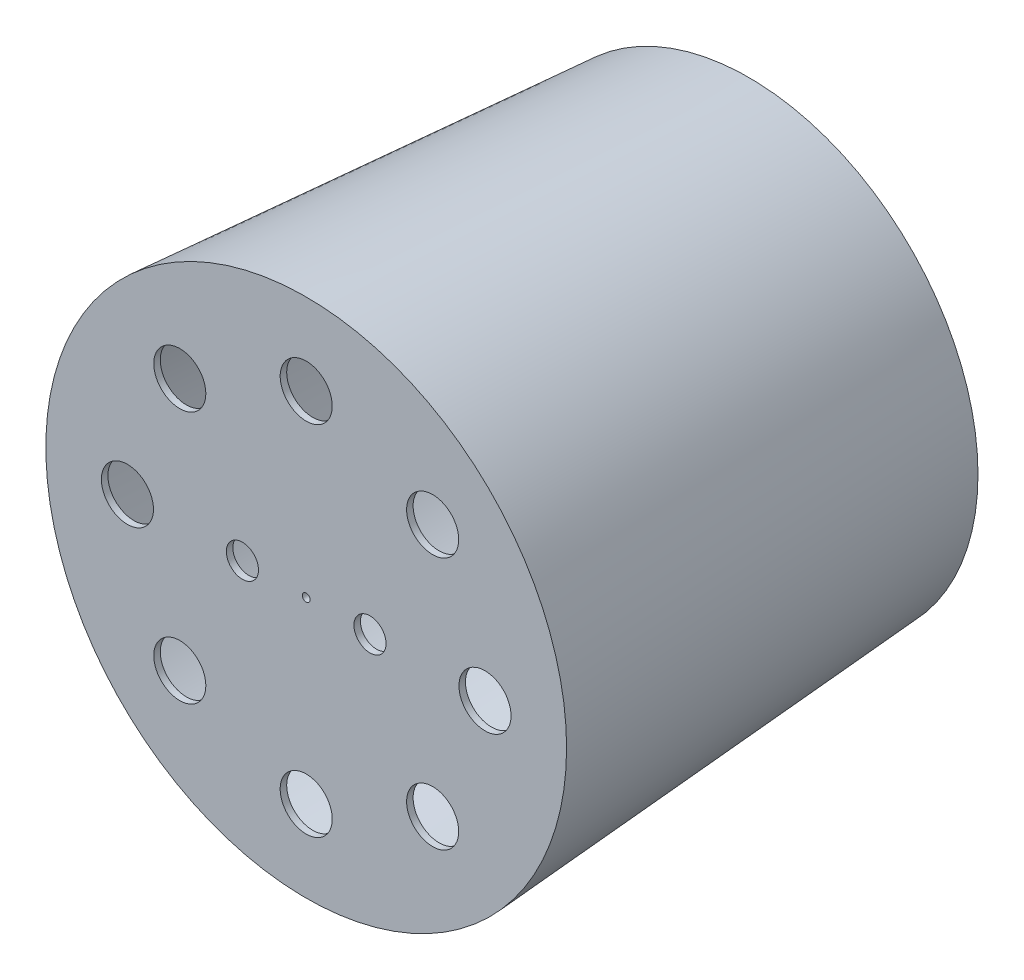
ISO-10303-21;
HEADER;
FILE_DESCRIPTION(('STEP AP214'),'2;1');
FILE_NAME('part.step','',(''),(''),'','','');
FILE_SCHEMA(('AUTOMOTIVE_DESIGN { 1 0 10303 214 1 1 1 1 }'));
ENDSEC;
DATA;
#1=APPLICATION_CONTEXT('core data for automotive mechanical design processes');
#2=APPLICATION_PROTOCOL_DEFINITION('international standard','automotive_design',2000,#1);
#3=PRODUCT_CONTEXT('',#1,'mechanical');
#4=PRODUCT('Part','Part','',(#3));
#5=PRODUCT_RELATED_PRODUCT_CATEGORY('part','',(#4));
#6=PRODUCT_DEFINITION_FORMATION('','',#4);
#7=PRODUCT_DEFINITION_CONTEXT('part definition',#1,'design');
#8=PRODUCT_DEFINITION('design','',#6,#7);
#9=PRODUCT_DEFINITION_SHAPE('','',#8);
#10=(LENGTH_UNIT() NAMED_UNIT(*) SI_UNIT(.MILLI.,.METRE.));
#11=(NAMED_UNIT(*) PLANE_ANGLE_UNIT() SI_UNIT($,.RADIAN.));
#12=(NAMED_UNIT(*) SI_UNIT($,.STERADIAN.) SOLID_ANGLE_UNIT());
#13=UNCERTAINTY_MEASURE_WITH_UNIT(LENGTH_MEASURE(1.E-05),#10,'distance_accuracy_value','');
#14=(GEOMETRIC_REPRESENTATION_CONTEXT(3) GLOBAL_UNCERTAINTY_ASSIGNED_CONTEXT((#13)) GLOBAL_UNIT_ASSIGNED_CONTEXT((#10,
#11,#12)) REPRESENTATION_CONTEXT('',''));
#15=CARTESIAN_POINT('',(0.,0.,0.));
#16=DIRECTION('',(0.,0.,1.));
#17=DIRECTION('',(1.,0.,0.));
#18=AXIS2_PLACEMENT_3D('',#15,#16,#17);
#19=CARTESIAN_POINT('',(0.,0.,-85.));
#20=DIRECTION('',(0.,0.,1.));
#21=DIRECTION('',(1.,0.,0.));
#22=AXIS2_PLACEMENT_3D('',#19,#20,#21);
#23=PLANE('',#22);
#24=CARTESIAN_POINT('',(0.,0.,-85.));
#25=DIRECTION('',(0.,0.,1.));
#26=DIRECTION('',(1.,0.,0.));
#27=AXIS2_PLACEMENT_3D('',#24,#25,#26);
#28=CIRCLE('',#27,85.4937793655562);
#29=CARTESIAN_POINT('',(85.4937793655561,0.,-85.));
#30=VERTEX_POINT('',#29);
#31=EDGE_CURVE('E97',#30,#30,#28,.T.);
#32=ORIENTED_EDGE('',*,*,#31,.T.);
#33=EDGE_LOOP('',(#32));
#34=FACE_BOUND('',#33,.T.);
#35=CARTESIAN_POINT('',(0.,0.,-85.));
#36=DIRECTION('',(0.,0.,1.));
#37=DIRECTION('',(1.,0.,0.));
#38=AXIS2_PLACEMENT_3D('',#35,#36,#37);
#39=CIRCLE('',#38,88.);
#40=CARTESIAN_POINT('',(88.,0.,-85.));
#41=VERTEX_POINT('',#40);
#42=EDGE_CURVE('E38',#41,#41,#39,.T.);
#43=ORIENTED_EDGE('',*,*,#42,.F.);
#44=EDGE_LOOP('',(#43));
#45=FACE_BOUND('',#44,.T.);
#46=ADVANCED_FACE('F31',(#34,#45),#23,.F.);
#47=CARTESIAN_POINT('',(-100.,0.,85.));
#48=DIRECTION('',(0.,0.,-1.));
#49=DIRECTION('',(-1.,0.,0.));
#50=AXIS2_PLACEMENT_3D('',#47,#48,#49);
#51=PLANE('',#50);
#52=CARTESIAN_POINT('',(48.5547126704819,48.5547126704831,85.));
#53=DIRECTION('',(0.,0.,1.));
#54=DIRECTION('',(1.,0.,0.));
#55=AXIS2_PLACEMENT_3D('',#52,#53,#54);
#56=CIRCLE('',#55,10.);
#57=CARTESIAN_POINT('',(58.5547126704819,48.5547126704831,85.));
#58=VERTEX_POINT('',#57);
#59=EDGE_CURVE('E56',#58,#58,#56,.T.);
#60=ORIENTED_EDGE('',*,*,#59,.F.);
#61=EDGE_LOOP('',(#60));
#62=FACE_BOUND('',#61,.T.);
#63=CARTESIAN_POINT('',(68.666733175726,2.91902965728407E-12,85.));
#64=DIRECTION('',(0.,0.,1.));
#65=DIRECTION('',(1.,0.,0.));
#66=AXIS2_PLACEMENT_3D('',#63,#64,#65);
#67=CIRCLE('',#66,9.99999999999999);
#68=CARTESIAN_POINT('',(78.666733175726,2.91902965728407E-12,85.));
#69=VERTEX_POINT('',#68);
#70=EDGE_CURVE('E139',#69,#69,#67,.T.);
#71=ORIENTED_EDGE('',*,*,#70,.F.);
#72=EDGE_LOOP('',(#71));
#73=FACE_BOUND('',#72,.T.);
#74=CARTESIAN_POINT('',(48.554712670486,-48.554712670479,85.));
#75=DIRECTION('',(0.,0.,1.));
#76=DIRECTION('',(1.,0.,0.));
#77=AXIS2_PLACEMENT_3D('',#74,#75,#76);
#78=CIRCLE('',#77,10.);
#79=CARTESIAN_POINT('',(58.554712670486,-48.554712670479,85.));
#80=VERTEX_POINT('',#79);
#81=EDGE_CURVE('E143',#80,#80,#78,.T.);
#82=ORIENTED_EDGE('',*,*,#81,.F.);
#83=EDGE_LOOP('',(#82));
#84=FACE_BOUND('',#83,.T.);
#85=CARTESIAN_POINT('',(5.83420882102425E-12,-68.6667331757231,85.));
#86=DIRECTION('',(0.,0.,1.));
#87=DIRECTION('',(1.,0.,0.));
#88=AXIS2_PLACEMENT_3D('',#85,#86,#87);
#89=CIRCLE('',#88,10.);
#90=CARTESIAN_POINT('',(10.0000000000058,-68.6667331757231,85.));
#91=VERTEX_POINT('',#90);
#92=EDGE_CURVE('E147',#91,#91,#89,.T.);
#93=ORIENTED_EDGE('',*,*,#92,.F.);
#94=EDGE_LOOP('',(#93));
#95=FACE_BOUND('',#94,.T.);
#96=CARTESIAN_POINT('',(-48.5547126704761,-48.5547126704831,85.));
#97=DIRECTION('',(0.,0.,1.));
#98=DIRECTION('',(1.,0.,0.));
#99=AXIS2_PLACEMENT_3D('',#96,#97,#98);
#100=CIRCLE('',#99,10.);
#101=CARTESIAN_POINT('',(-38.5547126704761,-48.5547126704831,85.));
#102=VERTEX_POINT('',#101);
#103=EDGE_CURVE('E151',#102,#102,#100,.T.);
#104=ORIENTED_EDGE('',*,*,#103,.F.);
#105=EDGE_LOOP('',(#104));
#106=FACE_BOUND('',#105,.T.);
#107=CARTESIAN_POINT('',(-68.6667331757202,-2.92743890678323E-12,85.));
#108=DIRECTION('',(0.,0.,1.));
#109=DIRECTION('',(1.,0.,0.));
#110=AXIS2_PLACEMENT_3D('',#107,#108,#109);
#111=CIRCLE('',#110,10.);
#112=CARTESIAN_POINT('',(-58.6667331757202,-2.92743890678323E-12,85.));
#113=VERTEX_POINT('',#112);
#114=EDGE_CURVE('E155',#113,#113,#111,.T.);
#115=ORIENTED_EDGE('',*,*,#114,.F.);
#116=EDGE_LOOP('',(#115));
#117=FACE_BOUND('',#116,.T.);
#118=CARTESIAN_POINT('',(-48.5547126704802,48.554712670479,85.));
#119=DIRECTION('',(0.,0.,1.));
#120=DIRECTION('',(1.,0.,0.));
#121=AXIS2_PLACEMENT_3D('',#118,#119,#120);
#122=CIRCLE('',#121,10.);
#123=CARTESIAN_POINT('',(-38.5547126704802,48.554712670479,85.));
#124=VERTEX_POINT('',#123);
#125=EDGE_CURVE('E80',#124,#124,#122,.T.);
#126=ORIENTED_EDGE('',*,*,#125,.F.);
#127=EDGE_LOOP('',(#126));
#128=FACE_BOUND('',#127,.T.);
#129=CARTESIAN_POINT('',(0.,68.6667331757231,85.));
#130=DIRECTION('',(0.,0.,1.));
#131=DIRECTION('',(1.,0.,0.));
#132=AXIS2_PLACEMENT_3D('',#129,#130,#131);
#133=CIRCLE('',#132,10.);
#134=CARTESIAN_POINT('',(10.,68.6667331757231,85.));
#135=VERTEX_POINT('',#134);
#136=EDGE_CURVE('E51',#135,#135,#133,.T.);
#137=ORIENTED_EDGE('',*,*,#136,.F.);
#138=EDGE_LOOP('',(#137));
#139=FACE_BOUND('',#138,.T.);
#140=CARTESIAN_POINT('',(-24.5,0.,85.));
#141=DIRECTION('',(0.,0.,1.));
#142=DIRECTION('',(1.,0.,0.));
#143=AXIS2_PLACEMENT_3D('',#140,#141,#142);
#144=CIRCLE('',#143,6.175);
#145=CARTESIAN_POINT('',(-18.325,0.,85.));
#146=VERTEX_POINT('',#145);
#147=EDGE_CURVE('E82',#146,#146,#144,.T.);
#148=ORIENTED_EDGE('',*,*,#147,.F.);
#149=EDGE_LOOP('',(#148));
#150=FACE_BOUND('',#149,.T.);
#151=CARTESIAN_POINT('',(24.5,0.,85.));
#152=DIRECTION('',(0.,0.,1.));
#153=DIRECTION('',(1.,0.,0.));
#154=AXIS2_PLACEMENT_3D('',#151,#152,#153);
#155=CIRCLE('',#154,6.175);
#156=CARTESIAN_POINT('',(30.675,0.,85.));
#157=VERTEX_POINT('',#156);
#158=EDGE_CURVE('E89',#157,#157,#155,.T.);
#159=ORIENTED_EDGE('',*,*,#158,.F.);
#160=EDGE_LOOP('',(#159));
#161=FACE_BOUND('',#160,.T.);
#162=CARTESIAN_POINT('',(0.,0.,85.));
#163=DIRECTION('',(0.,0.,1.));
#164=DIRECTION('',(1.,0.,0.));
#165=AXIS2_PLACEMENT_3D('',#162,#163,#164);
#166=CIRCLE('',#165,1.5);
#167=CARTESIAN_POINT('',(1.5,0.,85.));
#168=VERTEX_POINT('',#167);
#169=EDGE_CURVE('E94',#168,#168,#166,.T.);
#170=ORIENTED_EDGE('',*,*,#169,.F.);
#171=EDGE_LOOP('',(#170));
#172=FACE_BOUND('',#171,.T.);
#173=CARTESIAN_POINT('',(0.,0.,85.));
#174=DIRECTION('',(0.,0.,1.));
#175=DIRECTION('',(1.,0.,0.));
#176=AXIS2_PLACEMENT_3D('',#173,#174,#175);
#177=CIRCLE('',#176,100.);
#178=CARTESIAN_POINT('',(100.,0.,85.));
#179=VERTEX_POINT('',#178);
#180=EDGE_CURVE('E10',#179,#179,#177,.T.);
#181=ORIENTED_EDGE('',*,*,#180,.T.);
#182=EDGE_LOOP('',(#181));
#183=FACE_BOUND('',#182,.T.);
#184=ADVANCED_FACE('F124',(#62,#73,#84,#95,#106,#117,#128,#139,#150,#161,#172,#183),#51,.F.);
#185=CARTESIAN_POINT('',(0.,0.,-85.));
#186=DIRECTION('',(0.,0.,1.));
#187=DIRECTION('',(1.,0.,0.));
#188=AXIS2_PLACEMENT_3D('',#185,#186,#187);
#189=CONICAL_SURFACE('',#188,88.,0.0704713445787956);
#190=ORIENTED_EDGE('',*,*,#180,.F.);
#191=EDGE_LOOP('',(#190));
#192=FACE_BOUND('',#191,.T.);
#193=ORIENTED_EDGE('',*,*,#42,.T.);
#194=EDGE_LOOP('',(#193));
#195=FACE_BOUND('',#194,.T.);
#196=ADVANCED_FACE('F119',(#192,#195),#189,.T.);
#197=CARTESIAN_POINT('',(-100.,0.,82.5));
#198=DIRECTION('',(0.,0.,-1.));
#199=DIRECTION('',(-1.,0.,0.));
#200=AXIS2_PLACEMENT_3D('',#197,#198,#199);
#201=PLANE('',#200);
#202=CARTESIAN_POINT('',(48.5547126704819,48.5547126704831,82.5));
#203=DIRECTION('',(0.,0.,-1.));
#204=DIRECTION('',(-1.,0.,0.));
#205=AXIS2_PLACEMENT_3D('',#202,#203,#204);
#206=CIRCLE('',#205,10.);
#207=CARTESIAN_POINT('',(38.5547126704819,48.5547126704831,82.5));
#208=VERTEX_POINT('',#207);
#209=EDGE_CURVE('E34',#208,#208,#206,.T.);
#210=ORIENTED_EDGE('',*,*,#209,.F.);
#211=EDGE_LOOP('',(#210));
#212=FACE_BOUND('',#211,.T.);
#213=CARTESIAN_POINT('',(68.666733175726,2.91902965728407E-12,82.5));
#214=DIRECTION('',(0.,0.,-1.));
#215=DIRECTION('',(-1.,0.,0.));
#216=AXIS2_PLACEMENT_3D('',#213,#214,#215);
#217=CIRCLE('',#216,9.99999999999999);
#218=CARTESIAN_POINT('',(58.666733175726,2.91902965728407E-12,82.5));
#219=VERTEX_POINT('',#218);
#220=EDGE_CURVE('E67',#219,#219,#217,.T.);
#221=ORIENTED_EDGE('',*,*,#220,.F.);
#222=EDGE_LOOP('',(#221));
#223=FACE_BOUND('',#222,.T.);
#224=CARTESIAN_POINT('',(48.554712670486,-48.554712670479,82.5));
#225=DIRECTION('',(0.,0.,-1.));
#226=DIRECTION('',(-1.,0.,0.));
#227=AXIS2_PLACEMENT_3D('',#224,#225,#226);
#228=CIRCLE('',#227,10.);
#229=CARTESIAN_POINT('',(38.554712670486,-48.554712670479,82.5));
#230=VERTEX_POINT('',#229);
#231=EDGE_CURVE('E65',#230,#230,#228,.T.);
#232=ORIENTED_EDGE('',*,*,#231,.F.);
#233=EDGE_LOOP('',(#232));
#234=FACE_BOUND('',#233,.T.);
#235=CARTESIAN_POINT('',(5.83420882102425E-12,-68.6667331757231,82.5));
#236=DIRECTION('',(0.,0.,-1.));
#237=DIRECTION('',(-1.,0.,0.));
#238=AXIS2_PLACEMENT_3D('',#235,#236,#237);
#239=CIRCLE('',#238,10.);
#240=CARTESIAN_POINT('',(-9.99999999999417,-68.6667331757231,82.5));
#241=VERTEX_POINT('',#240);
#242=EDGE_CURVE('E62',#241,#241,#239,.T.);
#243=ORIENTED_EDGE('',*,*,#242,.F.);
#244=EDGE_LOOP('',(#243));
#245=FACE_BOUND('',#244,.T.);
#246=CARTESIAN_POINT('',(-48.5547126704761,-48.5547126704831,82.5));
#247=DIRECTION('',(0.,0.,-1.));
#248=DIRECTION('',(-1.,0.,0.));
#249=AXIS2_PLACEMENT_3D('',#246,#247,#248);
#250=CIRCLE('',#249,10.);
#251=CARTESIAN_POINT('',(-58.5547126704761,-48.5547126704831,82.5));
#252=VERTEX_POINT('',#251);
#253=EDGE_CURVE('E59',#252,#252,#250,.T.);
#254=ORIENTED_EDGE('',*,*,#253,.F.);
#255=EDGE_LOOP('',(#254));
#256=FACE_BOUND('',#255,.T.);
#257=CARTESIAN_POINT('',(-68.6667331757202,-2.92743890678323E-12,82.5));
#258=DIRECTION('',(0.,0.,-1.));
#259=DIRECTION('',(-1.,0.,0.));
#260=AXIS2_PLACEMENT_3D('',#257,#258,#259);
#261=CIRCLE('',#260,10.);
#262=CARTESIAN_POINT('',(-78.6667331757202,-2.92743890678323E-12,82.5));
#263=VERTEX_POINT('',#262);
#264=EDGE_CURVE('E55',#263,#263,#261,.T.);
#265=ORIENTED_EDGE('',*,*,#264,.F.);
#266=EDGE_LOOP('',(#265));
#267=FACE_BOUND('',#266,.T.);
#268=CARTESIAN_POINT('',(-48.5547126704802,48.554712670479,82.5));
#269=DIRECTION('',(0.,0.,-1.));
#270=DIRECTION('',(-1.,0.,0.));
#271=AXIS2_PLACEMENT_3D('',#268,#269,#270);
#272=CIRCLE('',#271,10.);
#273=CARTESIAN_POINT('',(-58.5547126704802,48.554712670479,82.5));
#274=VERTEX_POINT('',#273);
#275=EDGE_CURVE('E52',#274,#274,#272,.T.);
#276=ORIENTED_EDGE('',*,*,#275,.F.);
#277=EDGE_LOOP('',(#276));
#278=FACE_BOUND('',#277,.T.);
#279=CARTESIAN_POINT('',(0.,68.6667331757231,82.5));
#280=DIRECTION('',(0.,0.,-1.));
#281=DIRECTION('',(-1.,0.,0.));
#282=AXIS2_PLACEMENT_3D('',#279,#280,#281);
#283=CIRCLE('',#282,10.);
#284=CARTESIAN_POINT('',(-10.,68.6667331757231,82.5));
#285=VERTEX_POINT('',#284);
#286=EDGE_CURVE('E47',#285,#285,#283,.T.);
#287=ORIENTED_EDGE('',*,*,#286,.F.);
#288=EDGE_LOOP('',(#287));
#289=FACE_BOUND('',#288,.T.);
#290=CARTESIAN_POINT('',(-24.5,0.,82.5));
#291=DIRECTION('',(0.,0.,-1.));
#292=DIRECTION('',(-1.,0.,0.));
#293=AXIS2_PLACEMENT_3D('',#290,#291,#292);
#294=CIRCLE('',#293,6.175);
#295=CARTESIAN_POINT('',(-30.675,0.,82.5));
#296=VERTEX_POINT('',#295);
#297=EDGE_CURVE('E86',#296,#296,#294,.F.);
#298=ORIENTED_EDGE('',*,*,#297,.T.);
#299=EDGE_LOOP('',(#298));
#300=FACE_BOUND('',#299,.T.);
#301=CARTESIAN_POINT('',(24.5,0.,82.5));
#302=DIRECTION('',(0.,0.,-1.));
#303=DIRECTION('',(-1.,0.,0.));
#304=AXIS2_PLACEMENT_3D('',#301,#302,#303);
#305=CIRCLE('',#304,6.175);
#306=CARTESIAN_POINT('',(18.325,0.,82.5));
#307=VERTEX_POINT('',#306);
#308=EDGE_CURVE('E50',#307,#307,#305,.F.);
#309=ORIENTED_EDGE('',*,*,#308,.T.);
#310=EDGE_LOOP('',(#309));
#311=FACE_BOUND('',#310,.T.);
#312=CARTESIAN_POINT('',(0.,0.,82.5));
#313=DIRECTION('',(0.,0.,-1.));
#314=DIRECTION('',(-1.,0.,0.));
#315=AXIS2_PLACEMENT_3D('',#312,#313,#314);
#316=CIRCLE('',#315,1.5);
#317=CARTESIAN_POINT('',(-1.5,0.,82.5));
#318=VERTEX_POINT('',#317);
#319=EDGE_CURVE('E85',#318,#318,#316,.F.);
#320=ORIENTED_EDGE('',*,*,#319,.T.);
#321=EDGE_LOOP('',(#320));
#322=FACE_BOUND('',#321,.T.);
#323=CARTESIAN_POINT('',(0.,0.,82.5));
#324=DIRECTION('',(0.,0.,-1.));
#325=DIRECTION('',(-1.,0.,0.));
#326=AXIS2_PLACEMENT_3D('',#323,#324,#325);
#327=CIRCLE('',#326,97.3173087773209);
#328=CARTESIAN_POINT('',(-97.3173087773209,0.,82.5));
#329=VERTEX_POINT('',#328);
#330=EDGE_CURVE('E43',#329,#329,#327,.F.);
#331=ORIENTED_EDGE('',*,*,#330,.F.);
#332=EDGE_LOOP('',(#331));
#333=FACE_BOUND('',#332,.T.);
#334=ADVANCED_FACE('F109',(#212,#223,#234,#245,#256,#267,#278,#289,#300,#311,#322,#333),#201,.T.);
#335=CARTESIAN_POINT('',(0.,0.,-84.8239674254832));
#336=DIRECTION('',(0.,0.,1.));
#337=DIRECTION('',(1.,0.,0.));
#338=AXIS2_PLACEMENT_3D('',#335,#336,#337);
#339=CONICAL_SURFACE('',#338,85.5062051943456,0.0704713445787956);
#340=ORIENTED_EDGE('',*,*,#330,.T.);
#341=EDGE_LOOP('',(#340));
#342=FACE_BOUND('',#341,.T.);
#343=ORIENTED_EDGE('',*,*,#31,.F.);
#344=EDGE_LOOP('',(#343));
#345=FACE_BOUND('',#344,.T.);
#346=ADVANCED_FACE('F106',(#342,#345),#339,.F.);
#347=CARTESIAN_POINT('',(0.,0.,-85.001));
#348=DIRECTION('',(0.,0.,1.));
#349=DIRECTION('',(1.,0.,0.));
#350=AXIS2_PLACEMENT_3D('',#347,#348,#349);
#351=CYLINDRICAL_SURFACE('',#350,1.5);
#352=ORIENTED_EDGE('',*,*,#319,.F.);
#353=EDGE_LOOP('',(#352));
#354=FACE_BOUND('',#353,.T.);
#355=ORIENTED_EDGE('',*,*,#169,.T.);
#356=EDGE_LOOP('',(#355));
#357=FACE_BOUND('',#356,.T.);
#358=ADVANCED_FACE('F108',(#354,#357),#351,.F.);
#359=CARTESIAN_POINT('',(24.5,0.,-85.001));
#360=DIRECTION('',(0.,0.,1.));
#361=DIRECTION('',(1.,0.,0.));
#362=AXIS2_PLACEMENT_3D('',#359,#360,#361);
#363=CYLINDRICAL_SURFACE('',#362,6.175);
#364=ORIENTED_EDGE('',*,*,#308,.F.);
#365=EDGE_LOOP('',(#364));
#366=FACE_BOUND('',#365,.T.);
#367=ORIENTED_EDGE('',*,*,#158,.T.);
#368=EDGE_LOOP('',(#367));
#369=FACE_BOUND('',#368,.T.);
#370=ADVANCED_FACE('F116',(#366,#369),#363,.F.);
#371=CARTESIAN_POINT('',(-24.5,0.,-85.001));
#372=DIRECTION('',(0.,0.,1.));
#373=DIRECTION('',(1.,0.,0.));
#374=AXIS2_PLACEMENT_3D('',#371,#372,#373);
#375=CYLINDRICAL_SURFACE('',#374,6.175);
#376=ORIENTED_EDGE('',*,*,#297,.F.);
#377=EDGE_LOOP('',(#376));
#378=FACE_BOUND('',#377,.T.);
#379=ORIENTED_EDGE('',*,*,#147,.T.);
#380=EDGE_LOOP('',(#379));
#381=FACE_BOUND('',#380,.T.);
#382=ADVANCED_FACE('F168',(#378,#381),#375,.F.);
#383=CARTESIAN_POINT('',(0.,68.6667331757231,75.));
#384=DIRECTION('',(0.,0.,1.));
#385=DIRECTION('',(1.,0.,0.));
#386=AXIS2_PLACEMENT_3D('',#383,#384,#385);
#387=CYLINDRICAL_SURFACE('',#386,10.);
#388=ORIENTED_EDGE('',*,*,#286,.T.);
#389=EDGE_LOOP('',(#388));
#390=FACE_BOUND('',#389,.T.);
#391=ORIENTED_EDGE('',*,*,#136,.T.);
#392=EDGE_LOOP('',(#391));
#393=FACE_BOUND('',#392,.T.);
#394=ADVANCED_FACE('F174',(#390,#393),#387,.F.);
#395=CARTESIAN_POINT('',(-48.5547126704802,48.554712670479,75.));
#396=DIRECTION('',(0.,0.,1.));
#397=DIRECTION('',(1.,0.,0.));
#398=AXIS2_PLACEMENT_3D('',#395,#396,#397);
#399=CYLINDRICAL_SURFACE('',#398,10.);
#400=ORIENTED_EDGE('',*,*,#275,.T.);
#401=EDGE_LOOP('',(#400));
#402=FACE_BOUND('',#401,.T.);
#403=ORIENTED_EDGE('',*,*,#125,.T.);
#404=EDGE_LOOP('',(#403));
#405=FACE_BOUND('',#404,.T.);
#406=ADVANCED_FACE('F181',(#402,#405),#399,.F.);
#407=CARTESIAN_POINT('',(-68.6667331757202,-2.92743890678323E-12,75.));
#408=DIRECTION('',(0.,0.,1.));
#409=DIRECTION('',(1.,0.,0.));
#410=AXIS2_PLACEMENT_3D('',#407,#408,#409);
#411=CYLINDRICAL_SURFACE('',#410,10.);
#412=ORIENTED_EDGE('',*,*,#264,.T.);
#413=EDGE_LOOP('',(#412));
#414=FACE_BOUND('',#413,.T.);
#415=ORIENTED_EDGE('',*,*,#114,.T.);
#416=EDGE_LOOP('',(#415));
#417=FACE_BOUND('',#416,.T.);
#418=ADVANCED_FACE('F185',(#414,#417),#411,.F.);
#419=CARTESIAN_POINT('',(-48.5547126704761,-48.5547126704831,75.));
#420=DIRECTION('',(0.,0.,1.));
#421=DIRECTION('',(1.,0.,0.));
#422=AXIS2_PLACEMENT_3D('',#419,#420,#421);
#423=CYLINDRICAL_SURFACE('',#422,10.);
#424=ORIENTED_EDGE('',*,*,#253,.T.);
#425=EDGE_LOOP('',(#424));
#426=FACE_BOUND('',#425,.T.);
#427=ORIENTED_EDGE('',*,*,#103,.T.);
#428=EDGE_LOOP('',(#427));
#429=FACE_BOUND('',#428,.T.);
#430=ADVANCED_FACE('F189',(#426,#429),#423,.F.);
#431=CARTESIAN_POINT('',(5.83420882102425E-12,-68.6667331757231,75.));
#432=DIRECTION('',(0.,0.,1.));
#433=DIRECTION('',(1.,0.,0.));
#434=AXIS2_PLACEMENT_3D('',#431,#432,#433);
#435=CYLINDRICAL_SURFACE('',#434,10.);
#436=ORIENTED_EDGE('',*,*,#242,.T.);
#437=EDGE_LOOP('',(#436));
#438=FACE_BOUND('',#437,.T.);
#439=ORIENTED_EDGE('',*,*,#92,.T.);
#440=EDGE_LOOP('',(#439));
#441=FACE_BOUND('',#440,.T.);
#442=ADVANCED_FACE('F193',(#438,#441),#435,.F.);
#443=CARTESIAN_POINT('',(48.554712670486,-48.554712670479,75.));
#444=DIRECTION('',(0.,0.,1.));
#445=DIRECTION('',(1.,0.,0.));
#446=AXIS2_PLACEMENT_3D('',#443,#444,#445);
#447=CYLINDRICAL_SURFACE('',#446,10.);
#448=ORIENTED_EDGE('',*,*,#231,.T.);
#449=EDGE_LOOP('',(#448));
#450=FACE_BOUND('',#449,.T.);
#451=ORIENTED_EDGE('',*,*,#81,.T.);
#452=EDGE_LOOP('',(#451));
#453=FACE_BOUND('',#452,.T.);
#454=ADVANCED_FACE('F197',(#450,#453),#447,.F.);
#455=CARTESIAN_POINT('',(68.666733175726,2.91902965728407E-12,75.));
#456=DIRECTION('',(0.,0.,1.));
#457=DIRECTION('',(1.,0.,0.));
#458=AXIS2_PLACEMENT_3D('',#455,#456,#457);
#459=CYLINDRICAL_SURFACE('',#458,9.99999999999999);
#460=ORIENTED_EDGE('',*,*,#220,.T.);
#461=EDGE_LOOP('',(#460));
#462=FACE_BOUND('',#461,.T.);
#463=ORIENTED_EDGE('',*,*,#70,.T.);
#464=EDGE_LOOP('',(#463));
#465=FACE_BOUND('',#464,.T.);
#466=ADVANCED_FACE('F201',(#462,#465),#459,.F.);
#467=CARTESIAN_POINT('',(48.5547126704819,48.5547126704831,75.));
#468=DIRECTION('',(0.,0.,1.));
#469=DIRECTION('',(1.,0.,0.));
#470=AXIS2_PLACEMENT_3D('',#467,#468,#469);
#471=CYLINDRICAL_SURFACE('',#470,10.);
#472=ORIENTED_EDGE('',*,*,#209,.T.);
#473=EDGE_LOOP('',(#472));
#474=FACE_BOUND('',#473,.T.);
#475=ORIENTED_EDGE('',*,*,#59,.T.);
#476=EDGE_LOOP('',(#475));
#477=FACE_BOUND('',#476,.T.);
#478=ADVANCED_FACE('F205',(#474,#477),#471,.F.);
#479=CLOSED_SHELL('',(#46,#184,#196,#334,#346,#358,#370,#382,#394,#406,#418,#430,#442,#454,#466,#478));
#480=MANIFOLD_SOLID_BREP('B2',#479);
#481=ADVANCED_BREP_SHAPE_REPRESENTATION('',(#18,#480),#14);
#482=SHAPE_DEFINITION_REPRESENTATION(#9,#481);
ENDSEC;
END-ISO-10303-21;
